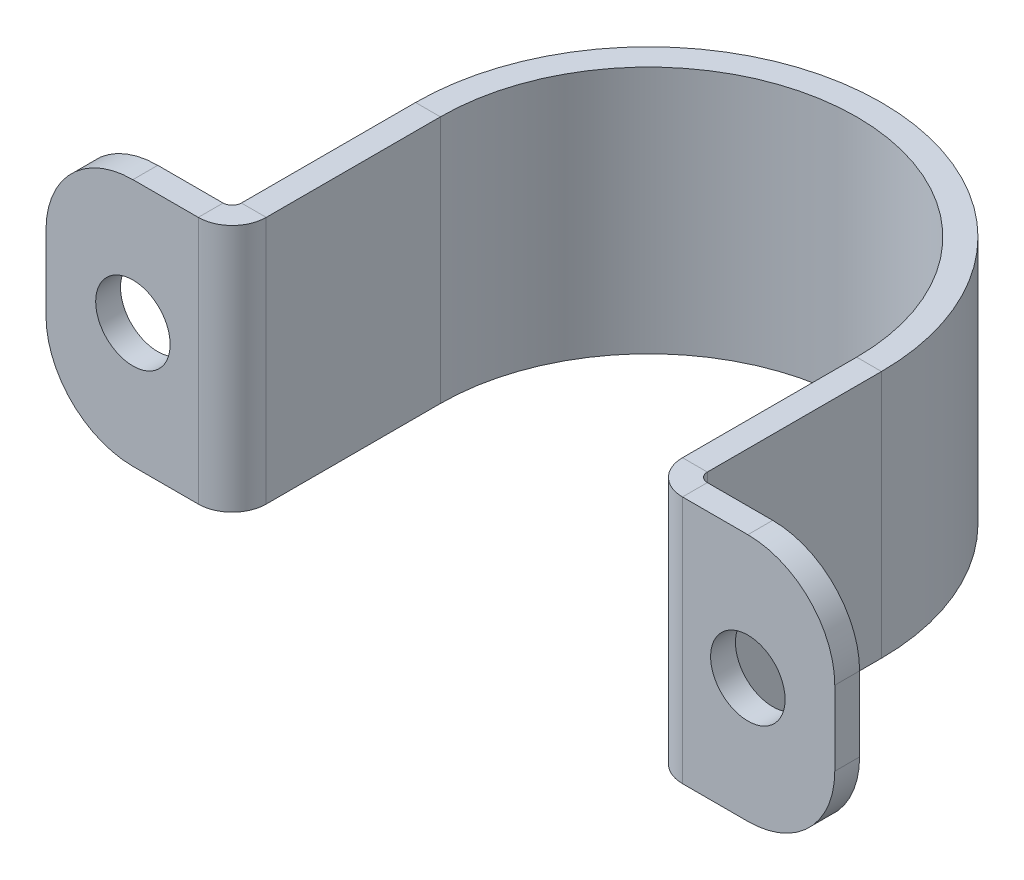
ISO-10303-21;
HEADER;
FILE_DESCRIPTION(('STEP AP214'),'2;1');
FILE_NAME('part.step','',(''),(''),'','','');
FILE_SCHEMA(('AUTOMOTIVE_DESIGN { 1 0 10303 214 1 1 1 1 }'));
ENDSEC;
DATA;
#1=APPLICATION_CONTEXT('core data for automotive mechanical design processes');
#2=APPLICATION_PROTOCOL_DEFINITION('international standard','automotive_design',2000,#1);
#3=PRODUCT_CONTEXT('',#1,'mechanical');
#4=PRODUCT('Part','Part','',(#3));
#5=PRODUCT_RELATED_PRODUCT_CATEGORY('part','',(#4));
#6=PRODUCT_DEFINITION_FORMATION('','',#4);
#7=PRODUCT_DEFINITION_CONTEXT('part definition',#1,'design');
#8=PRODUCT_DEFINITION('design','',#6,#7);
#9=PRODUCT_DEFINITION_SHAPE('','',#8);
#10=(LENGTH_UNIT() NAMED_UNIT(*) SI_UNIT(.MILLI.,.METRE.));
#11=(NAMED_UNIT(*) PLANE_ANGLE_UNIT() SI_UNIT($,.RADIAN.));
#12=(NAMED_UNIT(*) SI_UNIT($,.STERADIAN.) SOLID_ANGLE_UNIT());
#13=UNCERTAINTY_MEASURE_WITH_UNIT(LENGTH_MEASURE(1.E-05),#10,'distance_accuracy_value','');
#14=(GEOMETRIC_REPRESENTATION_CONTEXT(3) GLOBAL_UNCERTAINTY_ASSIGNED_CONTEXT((#13)) GLOBAL_UNIT_ASSIGNED_CONTEXT((#10,
#11,#12)) REPRESENTATION_CONTEXT('',''));
#15=CARTESIAN_POINT('',(0.,0.,0.));
#16=DIRECTION('',(0.,0.,1.));
#17=DIRECTION('',(1.,0.,0.));
#18=AXIS2_PLACEMENT_3D('',#15,#16,#17);
#19=CARTESIAN_POINT('',(-16.764,20.,-16.764));
#20=DIRECTION('',(0.,1.,0.));
#21=DIRECTION('',(0.,0.,1.));
#22=AXIS2_PLACEMENT_3D('',#19,#20,#21);
#23=PLANE('',#22);
#24=DIRECTION('',(-1.,0.,0.));
#25=VECTOR('',#24,1.);
#26=CARTESIAN_POINT('',(-16.764,20.,-16.764));
#27=LINE('',#26,#25);
#28=CARTESIAN_POINT('',(-16.764,20.,-16.764));
#29=VERTEX_POINT('',#28);
#30=CARTESIAN_POINT('',(-18.764,20.,-16.764));
#31=VERTEX_POINT('',#30);
#32=EDGE_CURVE('E345',#29,#31,#27,.T.);
#33=ORIENTED_EDGE('',*,*,#32,.F.);
#34=CARTESIAN_POINT('',(0.,20.,-16.764));
#35=DIRECTION('',(0.,-1.,0.));
#36=DIRECTION('',(0.,0.,-1.));
#37=AXIS2_PLACEMENT_3D('',#34,#35,#36);
#38=CIRCLE('',#37,16.764);
#39=CARTESIAN_POINT('',(16.764,20.,-16.764));
#40=VERTEX_POINT('',#39);
#41=EDGE_CURVE('E241',#29,#40,#38,.T.);
#42=ORIENTED_EDGE('',*,*,#41,.T.);
#43=DIRECTION('',(-1.,0.,0.));
#44=VECTOR('',#43,1.);
#45=CARTESIAN_POINT('',(18.764,20.,-16.764));
#46=LINE('',#45,#44);
#47=CARTESIAN_POINT('',(18.764,20.,-16.764));
#48=VERTEX_POINT('',#47);
#49=EDGE_CURVE('E343',#48,#40,#46,.T.);
#50=ORIENTED_EDGE('',*,*,#49,.F.);
#51=CARTESIAN_POINT('',(0.,20.,-16.764));
#52=DIRECTION('',(0.,1.,0.));
#53=DIRECTION('',(1.,0.,0.));
#54=AXIS2_PLACEMENT_3D('',#51,#52,#53);
#55=CIRCLE('',#54,18.764);
#56=EDGE_CURVE('E219',#31,#48,#55,.F.);
#57=ORIENTED_EDGE('',*,*,#56,.F.);
#58=EDGE_LOOP('',(#33,#42,#50,#57));
#59=FACE_BOUND('',#58,.T.);
#60=ADVANCED_FACE('F39',(#59),#23,.T.);
#61=CARTESIAN_POINT('',(18.764,20.,-16.764));
#62=DIRECTION('',(0.,1.,0.));
#63=DIRECTION('',(0.,0.,1.));
#64=AXIS2_PLACEMENT_3D('',#61,#62,#63);
#65=PLANE('',#64);
#66=DIRECTION('',(0.,0.,-1.));
#67=VECTOR('',#66,1.);
#68=CARTESIAN_POINT('',(-16.764,20.,0.));
#69=LINE('',#68,#67);
#70=CARTESIAN_POINT('',(-16.764,20.,-2.7366));
#71=VERTEX_POINT('',#70);
#72=EDGE_CURVE('E238',#71,#29,#69,.T.);
#73=ORIENTED_EDGE('',*,*,#72,.T.);
#74=ORIENTED_EDGE('',*,*,#32,.T.);
#75=DIRECTION('',(0.,0.,-1.));
#76=VECTOR('',#75,1.);
#77=CARTESIAN_POINT('',(-18.764,20.,0.));
#78=LINE('',#77,#76);
#79=CARTESIAN_POINT('',(-18.764,20.,-2.7366));
#80=VERTEX_POINT('',#79);
#81=EDGE_CURVE('E225',#80,#31,#78,.T.);
#82=ORIENTED_EDGE('',*,*,#81,.F.);
#83=DIRECTION('',(1.,0.,0.));
#84=VECTOR('',#83,1.);
#85=CARTESIAN_POINT('',(-18.764,20.,-2.7366));
#86=LINE('',#85,#84);
#87=EDGE_CURVE('E334',#80,#71,#86,.T.);
#88=ORIENTED_EDGE('',*,*,#87,.T.);
#89=EDGE_LOOP('',(#73,#74,#82,#88));
#90=FACE_BOUND('',#89,.T.);
#91=ADVANCED_FACE('F412',(#90),#65,.T.);
#92=CARTESIAN_POINT('',(16.764,0.,-16.764));
#93=DIRECTION('',(0.,-1.,0.));
#94=DIRECTION('',(0.,0.,-1.));
#95=AXIS2_PLACEMENT_3D('',#92,#93,#94);
#96=PLANE('',#95);
#97=DIRECTION('',(1.,0.,0.));
#98=VECTOR('',#97,1.);
#99=CARTESIAN_POINT('',(16.764,0.,-16.764));
#100=LINE('',#99,#98);
#101=CARTESIAN_POINT('',(16.764,0.,-16.764));
#102=VERTEX_POINT('',#101);
#103=CARTESIAN_POINT('',(18.764,0.,-16.764));
#104=VERTEX_POINT('',#103);
#105=EDGE_CURVE('E341',#102,#104,#100,.T.);
#106=ORIENTED_EDGE('',*,*,#105,.F.);
#107=CARTESIAN_POINT('',(0.,0.,-16.764));
#108=DIRECTION('',(0.,-1.,0.));
#109=DIRECTION('',(0.,0.,-1.));
#110=AXIS2_PLACEMENT_3D('',#107,#108,#109);
#111=CIRCLE('',#110,16.764);
#112=CARTESIAN_POINT('',(-16.764,0.,-16.764));
#113=VERTEX_POINT('',#112);
#114=EDGE_CURVE('E278',#113,#102,#111,.T.);
#115=ORIENTED_EDGE('',*,*,#114,.F.);
#116=DIRECTION('',(1.,0.,0.));
#117=VECTOR('',#116,1.);
#118=CARTESIAN_POINT('',(-18.764,0.,-16.764));
#119=LINE('',#118,#117);
#120=CARTESIAN_POINT('',(-18.764,0.,-16.764));
#121=VERTEX_POINT('',#120);
#122=EDGE_CURVE('E339',#121,#113,#119,.T.);
#123=ORIENTED_EDGE('',*,*,#122,.F.);
#124=CARTESIAN_POINT('',(0.,0.,-16.764));
#125=DIRECTION('',(0.,1.,0.));
#126=DIRECTION('',(1.,0.,0.));
#127=AXIS2_PLACEMENT_3D('',#124,#125,#126);
#128=CIRCLE('',#127,18.764);
#129=EDGE_CURVE('E259',#121,#104,#128,.F.);
#130=ORIENTED_EDGE('',*,*,#129,.T.);
#131=EDGE_LOOP('',(#106,#115,#123,#130));
#132=FACE_BOUND('',#131,.T.);
#133=ADVANCED_FACE('F477',(#132),#96,.T.);
#134=CARTESIAN_POINT('',(-18.764,0.,-16.764));
#135=DIRECTION('',(0.,-1.,0.));
#136=DIRECTION('',(0.,0.,-1.));
#137=AXIS2_PLACEMENT_3D('',#134,#135,#136);
#138=PLANE('',#137);
#139=DIRECTION('',(0.,0.,1.));
#140=VECTOR('',#139,1.);
#141=CARTESIAN_POINT('',(16.764,0.,0.));
#142=LINE('',#141,#140);
#143=CARTESIAN_POINT('',(16.764,0.,-2.7366));
#144=VERTEX_POINT('',#143);
#145=EDGE_CURVE('E281',#102,#144,#142,.T.);
#146=ORIENTED_EDGE('',*,*,#145,.F.);
#147=ORIENTED_EDGE('',*,*,#105,.T.);
#148=DIRECTION('',(0.,0.,-1.));
#149=VECTOR('',#148,1.);
#150=CARTESIAN_POINT('',(18.764,0.,0.));
#151=LINE('',#150,#149);
#152=CARTESIAN_POINT('',(18.764,0.,-2.7366));
#153=VERTEX_POINT('',#152);
#154=EDGE_CURVE('E256',#104,#153,#151,.F.);
#155=ORIENTED_EDGE('',*,*,#154,.T.);
#156=DIRECTION('',(-1.,0.,0.));
#157=VECTOR('',#156,1.);
#158=CARTESIAN_POINT('',(18.764,0.,-2.7366));
#159=LINE('',#158,#157);
#160=EDGE_CURVE('E325',#153,#144,#159,.T.);
#161=ORIENTED_EDGE('',*,*,#160,.T.);
#162=EDGE_LOOP('',(#146,#147,#155,#161));
#163=FACE_BOUND('',#162,.T.);
#164=ADVANCED_FACE('F739',(#163),#138,.T.);
#165=CARTESIAN_POINT('',(-19.5006,20.,0.));
#166=DIRECTION('',(0.,1.,0.));
#167=DIRECTION('',(0.,0.,1.));
#168=AXIS2_PLACEMENT_3D('',#165,#166,#167);
#169=PLANE('',#168);
#170=DIRECTION('',(0.,0.,-1.));
#171=VECTOR('',#170,1.);
#172=CARTESIAN_POINT('',(-19.5006,20.,0.));
#173=LINE('',#172,#171);
#174=CARTESIAN_POINT('',(-19.5006,20.,0.));
#175=VERTEX_POINT('',#174);
#176=CARTESIAN_POINT('',(-19.5006,20.,-2.));
#177=VERTEX_POINT('',#176);
#178=EDGE_CURVE('E336',#175,#177,#173,.T.);
#179=ORIENTED_EDGE('',*,*,#178,.F.);
#180=CARTESIAN_POINT('',(-19.5006,20.,-2.7366));
#181=DIRECTION('',(0.,-1.,0.));
#182=DIRECTION('',(0.,0.,-1.));
#183=AXIS2_PLACEMENT_3D('',#180,#181,#182);
#184=CIRCLE('',#183,2.7366);
#185=EDGE_CURVE('E235',#175,#71,#184,.F.);
#186=ORIENTED_EDGE('',*,*,#185,.T.);
#187=ORIENTED_EDGE('',*,*,#87,.F.);
#188=CARTESIAN_POINT('',(-19.5006,20.,-2.7366));
#189=DIRECTION('',(0.,1.,0.));
#190=DIRECTION('',(1.,0.,0.));
#191=AXIS2_PLACEMENT_3D('',#188,#189,#190);
#192=CIRCLE('',#191,0.7366);
#193=EDGE_CURVE('E228',#177,#80,#192,.T.);
#194=ORIENTED_EDGE('',*,*,#193,.F.);
#195=EDGE_LOOP('',(#179,#186,#187,#194));
#196=FACE_BOUND('',#195,.T.);
#197=ADVANCED_FACE('F403',(#196),#169,.T.);
#198=CARTESIAN_POINT('',(-18.764,20.,-2.7366));
#199=DIRECTION('',(0.,1.,0.));
#200=DIRECTION('',(0.,0.,1.));
#201=AXIS2_PLACEMENT_3D('',#198,#199,#200);
#202=PLANE('',#201);
#203=DIRECTION('',(1.,0.,0.));
#204=VECTOR('',#203,1.);
#205=CARTESIAN_POINT('',(-31.764,20.,-2.));
#206=LINE('',#205,#204);
#207=CARTESIAN_POINT('',(-24.764,20.,-2.));
#208=VERTEX_POINT('',#207);
#209=EDGE_CURVE('E231',#208,#177,#206,.T.);
#210=ORIENTED_EDGE('',*,*,#209,.F.);
#211=DIRECTION('',(0.,0.,-1.));
#212=VECTOR('',#211,1.);
#213=CARTESIAN_POINT('',(-24.764,20.,-2.7366));
#214=LINE('',#213,#212);
#215=CARTESIAN_POINT('',(-24.764,20.,0.));
#216=VERTEX_POINT('',#215);
#217=EDGE_CURVE('E11',#208,#216,#214,.F.);
#218=ORIENTED_EDGE('',*,*,#217,.T.);
#219=DIRECTION('',(1.,0.,0.));
#220=VECTOR('',#219,1.);
#221=CARTESIAN_POINT('',(-31.764,20.,0.));
#222=LINE('',#221,#220);
#223=EDGE_CURVE('E233',#216,#175,#222,.T.);
#224=ORIENTED_EDGE('',*,*,#223,.T.);
#225=ORIENTED_EDGE('',*,*,#178,.T.);
#226=EDGE_LOOP('',(#210,#218,#224,#225));
#227=FACE_BOUND('',#226,.T.);
#228=ADVANCED_FACE('F395',(#227),#202,.T.);
#229=CARTESIAN_POINT('',(-16.764,0.,-2.7366));
#230=DIRECTION('',(0.,-1.,0.));
#231=DIRECTION('',(0.,0.,-1.));
#232=AXIS2_PLACEMENT_3D('',#229,#230,#231);
#233=PLANE('',#232);
#234=DIRECTION('',(-1.,0.,0.));
#235=VECTOR('',#234,1.);
#236=CARTESIAN_POINT('',(-16.764,0.,-2.7366));
#237=LINE('',#236,#235);
#238=CARTESIAN_POINT('',(-16.764,0.,-2.7366));
#239=VERTEX_POINT('',#238);
#240=CARTESIAN_POINT('',(-18.764,0.,-2.7366));
#241=VERTEX_POINT('',#240);
#242=EDGE_CURVE('E332',#239,#241,#237,.T.);
#243=ORIENTED_EDGE('',*,*,#242,.F.);
#244=CARTESIAN_POINT('',(-19.5006,0.,-2.7366));
#245=DIRECTION('',(0.,-1.,0.));
#246=DIRECTION('',(0.,0.,-1.));
#247=AXIS2_PLACEMENT_3D('',#244,#245,#246);
#248=CIRCLE('',#247,2.7366);
#249=CARTESIAN_POINT('',(-19.5006,0.,0.));
#250=VERTEX_POINT('',#249);
#251=EDGE_CURVE('E272',#250,#239,#248,.F.);
#252=ORIENTED_EDGE('',*,*,#251,.F.);
#253=DIRECTION('',(0.,0.,1.));
#254=VECTOR('',#253,1.);
#255=CARTESIAN_POINT('',(-19.5006,0.,-2.));
#256=LINE('',#255,#254);
#257=CARTESIAN_POINT('',(-19.5006,0.,-2.));
#258=VERTEX_POINT('',#257);
#259=EDGE_CURVE('E329',#258,#250,#256,.T.);
#260=ORIENTED_EDGE('',*,*,#259,.F.);
#261=CARTESIAN_POINT('',(-19.5006,0.,-2.7366));
#262=DIRECTION('',(0.,1.,0.));
#263=DIRECTION('',(1.,0.,0.));
#264=AXIS2_PLACEMENT_3D('',#261,#262,#263);
#265=CIRCLE('',#264,0.7366);
#266=EDGE_CURVE('E265',#258,#241,#265,.T.);
#267=ORIENTED_EDGE('',*,*,#266,.T.);
#268=EDGE_LOOP('',(#243,#252,#260,#267));
#269=FACE_BOUND('',#268,.T.);
#270=ADVANCED_FACE('F746',(#269),#233,.T.);
#271=CARTESIAN_POINT('',(-19.5006,0.,-2.));
#272=DIRECTION('',(0.,-1.,0.));
#273=DIRECTION('',(0.,0.,-1.));
#274=AXIS2_PLACEMENT_3D('',#271,#272,#273);
#275=PLANE('',#274);
#276=DIRECTION('',(0.,0.,-1.));
#277=VECTOR('',#276,1.);
#278=CARTESIAN_POINT('',(-16.764,0.,0.));
#279=LINE('',#278,#277);
#280=EDGE_CURVE('E275',#239,#113,#279,.T.);
#281=ORIENTED_EDGE('',*,*,#280,.F.);
#282=ORIENTED_EDGE('',*,*,#242,.T.);
#283=DIRECTION('',(0.,0.,-1.));
#284=VECTOR('',#283,1.);
#285=CARTESIAN_POINT('',(-18.764,0.,0.));
#286=LINE('',#285,#284);
#287=EDGE_CURVE('E262',#241,#121,#286,.T.);
#288=ORIENTED_EDGE('',*,*,#287,.T.);
#289=ORIENTED_EDGE('',*,*,#122,.T.);
#290=EDGE_LOOP('',(#281,#282,#288,#289));
#291=FACE_BOUND('',#290,.T.);
#292=ADVANCED_FACE('F750',(#291),#275,.T.);
#293=CARTESIAN_POINT('',(16.764,20.,-2.7366));
#294=DIRECTION('',(0.,1.,0.));
#295=DIRECTION('',(0.,0.,1.));
#296=AXIS2_PLACEMENT_3D('',#293,#294,#295);
#297=PLANE('',#296);
#298=DIRECTION('',(1.,0.,0.));
#299=VECTOR('',#298,1.);
#300=CARTESIAN_POINT('',(16.764,20.,-2.7366));
#301=LINE('',#300,#299);
#302=CARTESIAN_POINT('',(16.764,20.,-2.7366));
#303=VERTEX_POINT('',#302);
#304=CARTESIAN_POINT('',(18.764,20.,-2.7366));
#305=VERTEX_POINT('',#304);
#306=EDGE_CURVE('E189',#303,#305,#301,.T.);
#307=ORIENTED_EDGE('',*,*,#306,.F.);
#308=CARTESIAN_POINT('',(19.5006,20.,-2.7366));
#309=DIRECTION('',(0.,-1.,0.));
#310=DIRECTION('',(0.,0.,-1.));
#311=AXIS2_PLACEMENT_3D('',#308,#309,#310);
#312=CIRCLE('',#311,2.7366);
#313=CARTESIAN_POINT('',(19.5006,20.,0.));
#314=VERTEX_POINT('',#313);
#315=EDGE_CURVE('E184',#303,#314,#312,.F.);
#316=ORIENTED_EDGE('',*,*,#315,.T.);
#317=DIRECTION('',(0.,0.,1.));
#318=VECTOR('',#317,1.);
#319=CARTESIAN_POINT('',(19.5006,20.,-2.));
#320=LINE('',#319,#318);
#321=CARTESIAN_POINT('',(19.5006,20.,-2.));
#322=VERTEX_POINT('',#321);
#323=EDGE_CURVE('E177',#322,#314,#320,.T.);
#324=ORIENTED_EDGE('',*,*,#323,.F.);
#325=CARTESIAN_POINT('',(19.5006,20.,-2.7366));
#326=DIRECTION('',(0.,1.,0.));
#327=DIRECTION('',(1.,0.,0.));
#328=AXIS2_PLACEMENT_3D('',#325,#326,#327);
#329=CIRCLE('',#328,0.7366);
#330=EDGE_CURVE('E181',#305,#322,#329,.T.);
#331=ORIENTED_EDGE('',*,*,#330,.F.);
#332=EDGE_LOOP('',(#307,#316,#324,#331));
#333=FACE_BOUND('',#332,.T.);
#334=ADVANCED_FACE('F179',(#333),#297,.T.);
#335=CARTESIAN_POINT('',(19.5006,20.,-2.));
#336=DIRECTION('',(0.,1.,0.));
#337=DIRECTION('',(0.,0.,1.));
#338=AXIS2_PLACEMENT_3D('',#335,#336,#337);
#339=PLANE('',#338);
#340=DIRECTION('',(0.,0.,1.));
#341=VECTOR('',#340,1.);
#342=CARTESIAN_POINT('',(16.764,20.,0.));
#343=LINE('',#342,#341);
#344=EDGE_CURVE('E244',#40,#303,#343,.T.);
#345=ORIENTED_EDGE('',*,*,#344,.T.);
#346=ORIENTED_EDGE('',*,*,#306,.T.);
#347=DIRECTION('',(0.,0.,-1.));
#348=VECTOR('',#347,1.);
#349=CARTESIAN_POINT('',(18.764,20.,0.));
#350=LINE('',#349,#348);
#351=EDGE_CURVE('E217',#48,#305,#350,.F.);
#352=ORIENTED_EDGE('',*,*,#351,.F.);
#353=ORIENTED_EDGE('',*,*,#49,.T.);
#354=EDGE_LOOP('',(#345,#346,#352,#353));
#355=FACE_BOUND('',#354,.T.);
#356=ADVANCED_FACE('F429',(#355),#339,.T.);
#357=CARTESIAN_POINT('',(19.5006,0.,0.));
#358=DIRECTION('',(0.,-1.,0.));
#359=DIRECTION('',(0.,0.,-1.));
#360=AXIS2_PLACEMENT_3D('',#357,#358,#359);
#361=PLANE('',#360);
#362=DIRECTION('',(0.,0.,-1.));
#363=VECTOR('',#362,1.);
#364=CARTESIAN_POINT('',(19.5006,0.,0.));
#365=LINE('',#364,#363);
#366=CARTESIAN_POINT('',(19.5006,0.,0.));
#367=VERTEX_POINT('',#366);
#368=CARTESIAN_POINT('',(19.5006,0.,-2.));
#369=VERTEX_POINT('',#368);
#370=EDGE_CURVE('E190',#367,#369,#365,.T.);
#371=ORIENTED_EDGE('',*,*,#370,.F.);
#372=CARTESIAN_POINT('',(19.5006,0.,-2.7366));
#373=DIRECTION('',(0.,-1.,0.));
#374=DIRECTION('',(0.,0.,-1.));
#375=AXIS2_PLACEMENT_3D('',#372,#373,#374);
#376=CIRCLE('',#375,2.7366);
#377=EDGE_CURVE('E284',#144,#367,#376,.F.);
#378=ORIENTED_EDGE('',*,*,#377,.F.);
#379=ORIENTED_EDGE('',*,*,#160,.F.);
#380=CARTESIAN_POINT('',(19.5006,0.,-2.7366));
#381=DIRECTION('',(0.,1.,0.));
#382=DIRECTION('',(1.,0.,0.));
#383=AXIS2_PLACEMENT_3D('',#380,#381,#382);
#384=CIRCLE('',#383,0.7366);
#385=EDGE_CURVE('E254',#153,#369,#384,.T.);
#386=ORIENTED_EDGE('',*,*,#385,.T.);
#387=EDGE_LOOP('',(#371,#378,#379,#386));
#388=FACE_BOUND('',#387,.T.);
#389=ADVANCED_FACE('F469',(#388),#361,.T.);
#390=CARTESIAN_POINT('',(18.764,0.,-2.7366));
#391=DIRECTION('',(0.,-1.,0.));
#392=DIRECTION('',(0.,0.,-1.));
#393=AXIS2_PLACEMENT_3D('',#390,#391,#392);
#394=PLANE('',#393);
#395=DIRECTION('',(1.,0.,0.));
#396=VECTOR('',#395,1.);
#397=CARTESIAN_POINT('',(16.764,0.,-2.));
#398=LINE('',#397,#396);
#399=CARTESIAN_POINT('',(24.764,0.,-2.));
#400=VERTEX_POINT('',#399);
#401=EDGE_CURVE('E202',#369,#400,#398,.T.);
#402=ORIENTED_EDGE('',*,*,#401,.T.);
#403=DIRECTION('',(0.,0.,1.));
#404=VECTOR('',#403,1.);
#405=CARTESIAN_POINT('',(24.764,0.,-2.7366));
#406=LINE('',#405,#404);
#407=CARTESIAN_POINT('',(24.764,0.,0.));
#408=VERTEX_POINT('',#407);
#409=EDGE_CURVE('E347',#400,#408,#406,.T.);
#410=ORIENTED_EDGE('',*,*,#409,.T.);
#411=DIRECTION('',(1.,0.,0.));
#412=VECTOR('',#411,1.);
#413=CARTESIAN_POINT('',(16.764,0.,0.));
#414=LINE('',#413,#412);
#415=EDGE_CURVE('E249',#367,#408,#414,.T.);
#416=ORIENTED_EDGE('',*,*,#415,.F.);
#417=ORIENTED_EDGE('',*,*,#370,.T.);
#418=EDGE_LOOP('',(#402,#410,#416,#417));
#419=FACE_BOUND('',#418,.T.);
#420=ADVANCED_FACE('F461',(#419),#394,.T.);
#421=CARTESIAN_POINT('',(16.764,20.,0.));
#422=DIRECTION('',(0.,0.,-1.));
#423=DIRECTION('',(-1.,0.,0.));
#424=AXIS2_PLACEMENT_3D('',#421,#422,#423);
#425=PLANE('',#424);
#426=CARTESIAN_POINT('',(24.764,10.,0.));
#427=DIRECTION('',(0.,0.,1.));
#428=DIRECTION('',(1.,0.,0.));
#429=AXIS2_PLACEMENT_3D('',#426,#427,#428);
#430=CIRCLE('',#429,3.);
#431=CARTESIAN_POINT('',(27.764,10.,0.));
#432=VERTEX_POINT('',#431);
#433=EDGE_CURVE('E447',#432,#432,#430,.T.);
#434=ORIENTED_EDGE('',*,*,#433,.F.);
#435=EDGE_LOOP('',(#434));
#436=FACE_BOUND('',#435,.T.);
#437=ORIENTED_EDGE('',*,*,#415,.T.);
#438=CARTESIAN_POINT('',(24.764,7.,0.));
#439=DIRECTION('',(0.,0.,-1.));
#440=DIRECTION('',(-1.,0.,0.));
#441=AXIS2_PLACEMENT_3D('',#438,#439,#440);
#442=CIRCLE('',#441,7.);
#443=CARTESIAN_POINT('',(31.764,7.,0.));
#444=VERTEX_POINT('',#443);
#445=EDGE_CURVE('E352',#408,#444,#442,.F.);
#446=ORIENTED_EDGE('',*,*,#445,.T.);
#447=DIRECTION('',(0.,-1.,0.));
#448=VECTOR('',#447,1.);
#449=CARTESIAN_POINT('',(31.764,20.,0.));
#450=LINE('',#449,#448);
#451=CARTESIAN_POINT('',(31.764,13.,0.));
#452=VERTEX_POINT('',#451);
#453=EDGE_CURVE('E322',#452,#444,#450,.T.);
#454=ORIENTED_EDGE('',*,*,#453,.F.);
#455=CARTESIAN_POINT('',(24.764,13.,0.));
#456=DIRECTION('',(0.,0.,-1.));
#457=DIRECTION('',(-1.,0.,0.));
#458=AXIS2_PLACEMENT_3D('',#455,#456,#457);
#459=CIRCLE('',#458,7.);
#460=CARTESIAN_POINT('',(24.764,20.,0.));
#461=VERTEX_POINT('',#460);
#462=EDGE_CURVE('E350',#452,#461,#459,.F.);
#463=ORIENTED_EDGE('',*,*,#462,.T.);
#464=DIRECTION('',(1.,0.,0.));
#465=VECTOR('',#464,1.);
#466=CARTESIAN_POINT('',(16.764,20.,0.));
#467=LINE('',#466,#465);
#468=EDGE_CURVE('E212',#314,#461,#467,.T.);
#469=ORIENTED_EDGE('',*,*,#468,.F.);
#470=DIRECTION('',(0.,-1.,0.));
#471=VECTOR('',#470,1.);
#472=CARTESIAN_POINT('',(19.5006,20.,0.));
#473=LINE('',#472,#471);
#474=EDGE_CURVE('E248',#314,#367,#473,.T.);
#475=ORIENTED_EDGE('',*,*,#474,.T.);
#476=EDGE_LOOP('',(#437,#446,#454,#463,#469,#475));
#477=FACE_BOUND('',#476,.T.);
#478=ADVANCED_FACE('F441',(#436,#477),#425,.F.);
#479=CARTESIAN_POINT('',(31.764,20.,-2.));
#480=DIRECTION('',(1.,0.,0.));
#481=DIRECTION('',(0.,0.,-1.));
#482=AXIS2_PLACEMENT_3D('',#479,#480,#481);
#483=PLANE('',#482);
#484=ORIENTED_EDGE('',*,*,#453,.T.);
#485=DIRECTION('',(0.,0.,1.));
#486=VECTOR('',#485,1.);
#487=CARTESIAN_POINT('',(31.764,7.,-2.));
#488=LINE('',#487,#486);
#489=CARTESIAN_POINT('',(31.764,7.,-2.));
#490=VERTEX_POINT('',#489);
#491=EDGE_CURVE('E357',#444,#490,#488,.F.);
#492=ORIENTED_EDGE('',*,*,#491,.T.);
#493=DIRECTION('',(0.,-1.,0.));
#494=VECTOR('',#493,1.);
#495=CARTESIAN_POINT('',(31.764,20.,-2.));
#496=LINE('',#495,#494);
#497=CARTESIAN_POINT('',(31.764,13.,-2.));
#498=VERTEX_POINT('',#497);
#499=EDGE_CURVE('E206',#498,#490,#496,.T.);
#500=ORIENTED_EDGE('',*,*,#499,.F.);
#501=DIRECTION('',(0.,0.,1.));
#502=VECTOR('',#501,1.);
#503=CARTESIAN_POINT('',(31.764,13.,-2.));
#504=LINE('',#503,#502);
#505=EDGE_CURVE('E354',#498,#452,#504,.T.);
#506=ORIENTED_EDGE('',*,*,#505,.T.);
#507=EDGE_LOOP('',(#484,#492,#500,#506));
#508=FACE_BOUND('',#507,.T.);
#509=ADVANCED_FACE('F460',(#508),#483,.T.);
#510=CARTESIAN_POINT('',(16.764,20.,-2.));
#511=DIRECTION('',(0.,0.,-1.));
#512=DIRECTION('',(-1.,0.,0.));
#513=AXIS2_PLACEMENT_3D('',#510,#511,#512);
#514=PLANE('',#513);
#515=CARTESIAN_POINT('',(24.764,10.,-2.));
#516=DIRECTION('',(0.,0.,1.));
#517=DIRECTION('',(1.,0.,0.));
#518=AXIS2_PLACEMENT_3D('',#515,#516,#517);
#519=CIRCLE('',#518,3.);
#520=CARTESIAN_POINT('',(27.764,10.,-2.));
#521=VERTEX_POINT('',#520);
#522=EDGE_CURVE('E450',#521,#521,#519,.T.);
#523=ORIENTED_EDGE('',*,*,#522,.T.);
#524=EDGE_LOOP('',(#523));
#525=FACE_BOUND('',#524,.T.);
#526=ORIENTED_EDGE('',*,*,#499,.T.);
#527=CARTESIAN_POINT('',(24.764,7.,-2.));
#528=DIRECTION('',(0.,0.,-1.));
#529=DIRECTION('',(-1.,0.,0.));
#530=AXIS2_PLACEMENT_3D('',#527,#528,#529);
#531=CIRCLE('',#530,7.);
#532=EDGE_CURVE('E361',#490,#400,#531,.T.);
#533=ORIENTED_EDGE('',*,*,#532,.T.);
#534=ORIENTED_EDGE('',*,*,#401,.F.);
#535=DIRECTION('',(0.,-1.,0.));
#536=VECTOR('',#535,1.);
#537=CARTESIAN_POINT('',(19.5006,20.,-2.));
#538=LINE('',#537,#536);
#539=EDGE_CURVE('E196',#322,#369,#538,.T.);
#540=ORIENTED_EDGE('',*,*,#539,.F.);
#541=DIRECTION('',(1.,0.,0.));
#542=VECTOR('',#541,1.);
#543=CARTESIAN_POINT('',(16.764,20.,-2.));
#544=LINE('',#543,#542);
#545=CARTESIAN_POINT('',(24.764,20.,-2.));
#546=VERTEX_POINT('',#545);
#547=EDGE_CURVE('E199',#322,#546,#544,.T.);
#548=ORIENTED_EDGE('',*,*,#547,.T.);
#549=CARTESIAN_POINT('',(24.764,13.,-2.));
#550=DIRECTION('',(0.,0.,-1.));
#551=DIRECTION('',(-1.,0.,0.));
#552=AXIS2_PLACEMENT_3D('',#549,#550,#551);
#553=CIRCLE('',#552,7.);
#554=EDGE_CURVE('E359',#546,#498,#553,.T.);
#555=ORIENTED_EDGE('',*,*,#554,.T.);
#556=EDGE_LOOP('',(#526,#533,#534,#540,#548,#555));
#557=FACE_BOUND('',#556,.T.);
#558=ADVANCED_FACE('F198',(#525,#557),#514,.T.);
#559=CARTESIAN_POINT('',(19.5006,20.,-2.7366));
#560=DIRECTION('',(0.,-1.,0.));
#561=DIRECTION('',(0.,0.,-1.));
#562=AXIS2_PLACEMENT_3D('',#559,#560,#561);
#563=CYLINDRICAL_SURFACE('',#562,0.7366);
#564=ORIENTED_EDGE('',*,*,#385,.F.);
#565=DIRECTION('',(0.,-1.,0.));
#566=VECTOR('',#565,1.);
#567=CARTESIAN_POINT('',(18.764,20.,-2.7366));
#568=LINE('',#567,#566);
#569=EDGE_CURVE('E207',#305,#153,#568,.T.);
#570=ORIENTED_EDGE('',*,*,#569,.F.);
#571=ORIENTED_EDGE('',*,*,#330,.T.);
#572=ORIENTED_EDGE('',*,*,#539,.T.);
#573=EDGE_LOOP('',(#564,#570,#571,#572));
#574=FACE_BOUND('',#573,.T.);
#575=ADVANCED_FACE('F215',(#574),#563,.F.);
#576=CARTESIAN_POINT('',(18.764,20.,0.));
#577=DIRECTION('',(1.,0.,0.));
#578=DIRECTION('',(0.,0.,-1.));
#579=AXIS2_PLACEMENT_3D('',#576,#577,#578);
#580=PLANE('',#579);
#581=ORIENTED_EDGE('',*,*,#154,.F.);
#582=DIRECTION('',(0.,-1.,0.));
#583=VECTOR('',#582,1.);
#584=CARTESIAN_POINT('',(18.764,20.,-16.764));
#585=LINE('',#584,#583);
#586=EDGE_CURVE('E317',#48,#104,#585,.T.);
#587=ORIENTED_EDGE('',*,*,#586,.F.);
#588=ORIENTED_EDGE('',*,*,#351,.T.);
#589=ORIENTED_EDGE('',*,*,#569,.T.);
#590=EDGE_LOOP('',(#581,#587,#588,#589));
#591=FACE_BOUND('',#590,.T.);
#592=ADVANCED_FACE('F428',(#591),#580,.T.);
#593=CARTESIAN_POINT('',(0.,20.,-16.764));
#594=DIRECTION('',(0.,-1.,0.));
#595=DIRECTION('',(0.,0.,-1.));
#596=AXIS2_PLACEMENT_3D('',#593,#594,#595);
#597=CYLINDRICAL_SURFACE('',#596,18.764);
#598=ORIENTED_EDGE('',*,*,#129,.F.);
#599=DIRECTION('',(0.,-1.,0.));
#600=VECTOR('',#599,1.);
#601=CARTESIAN_POINT('',(-18.764,20.,-16.764));
#602=LINE('',#601,#600);
#603=EDGE_CURVE('E314',#31,#121,#602,.T.);
#604=ORIENTED_EDGE('',*,*,#603,.F.);
#605=ORIENTED_EDGE('',*,*,#56,.T.);
#606=ORIENTED_EDGE('',*,*,#586,.T.);
#607=EDGE_LOOP('',(#598,#604,#605,#606));
#608=FACE_BOUND('',#607,.T.);
#609=ADVANCED_FACE('F420',(#608),#597,.T.);
#610=CARTESIAN_POINT('',(-18.764,20.,0.));
#611=DIRECTION('',(-1.,0.,0.));
#612=DIRECTION('',(0.,0.,1.));
#613=AXIS2_PLACEMENT_3D('',#610,#611,#612);
#614=PLANE('',#613);
#615=ORIENTED_EDGE('',*,*,#287,.F.);
#616=DIRECTION('',(0.,-1.,0.));
#617=VECTOR('',#616,1.);
#618=CARTESIAN_POINT('',(-18.764,20.,-2.7366));
#619=LINE('',#618,#617);
#620=EDGE_CURVE('E311',#80,#241,#619,.T.);
#621=ORIENTED_EDGE('',*,*,#620,.F.);
#622=ORIENTED_EDGE('',*,*,#81,.T.);
#623=ORIENTED_EDGE('',*,*,#603,.T.);
#624=EDGE_LOOP('',(#615,#621,#622,#623));
#625=FACE_BOUND('',#624,.T.);
#626=ADVANCED_FACE('F411',(#625),#614,.T.);
#627=CARTESIAN_POINT('',(-19.5006,20.,-2.7366));
#628=DIRECTION('',(0.,-1.,0.));
#629=DIRECTION('',(0.,0.,-1.));
#630=AXIS2_PLACEMENT_3D('',#627,#628,#629);
#631=CYLINDRICAL_SURFACE('',#630,0.7366);
#632=ORIENTED_EDGE('',*,*,#266,.F.);
#633=DIRECTION('',(0.,-1.,0.));
#634=VECTOR('',#633,1.);
#635=CARTESIAN_POINT('',(-19.5006,20.,-2.));
#636=LINE('',#635,#634);
#637=EDGE_CURVE('E308',#177,#258,#636,.T.);
#638=ORIENTED_EDGE('',*,*,#637,.F.);
#639=ORIENTED_EDGE('',*,*,#193,.T.);
#640=ORIENTED_EDGE('',*,*,#620,.T.);
#641=EDGE_LOOP('',(#632,#638,#639,#640));
#642=FACE_BOUND('',#641,.T.);
#643=ADVANCED_FACE('F402',(#642),#631,.F.);
#644=CARTESIAN_POINT('',(-31.764,20.,-2.));
#645=DIRECTION('',(0.,0.,-1.));
#646=DIRECTION('',(-1.,0.,0.));
#647=AXIS2_PLACEMENT_3D('',#644,#645,#646);
#648=PLANE('',#647);
#649=CARTESIAN_POINT('',(-24.764,10.,-2.));
#650=DIRECTION('',(0.,0.,-1.));
#651=DIRECTION('',(-1.,0.,0.));
#652=AXIS2_PLACEMENT_3D('',#649,#650,#651);
#653=CIRCLE('',#652,3.);
#654=CARTESIAN_POINT('',(-27.764,10.,-2.));
#655=VERTEX_POINT('',#654);
#656=EDGE_CURVE('E444',#655,#655,#653,.T.);
#657=ORIENTED_EDGE('',*,*,#656,.F.);
#658=EDGE_LOOP('',(#657));
#659=FACE_BOUND('',#658,.T.);
#660=DIRECTION('',(1.,0.,0.));
#661=VECTOR('',#660,1.);
#662=CARTESIAN_POINT('',(-31.764,0.,-2.));
#663=LINE('',#662,#661);
#664=CARTESIAN_POINT('',(-24.764,0.,-2.));
#665=VERTEX_POINT('',#664);
#666=EDGE_CURVE('E268',#665,#258,#663,.T.);
#667=ORIENTED_EDGE('',*,*,#666,.F.);
#668=CARTESIAN_POINT('',(-24.764,7.,-2.));
#669=DIRECTION('',(0.,0.,-1.));
#670=DIRECTION('',(-1.,0.,0.));
#671=AXIS2_PLACEMENT_3D('',#668,#669,#670);
#672=CIRCLE('',#671,7.);
#673=CARTESIAN_POINT('',(-31.764,7.,-2.));
#674=VERTEX_POINT('',#673);
#675=EDGE_CURVE('E369',#665,#674,#672,.T.);
#676=ORIENTED_EDGE('',*,*,#675,.T.);
#677=DIRECTION('',(0.,-1.,0.));
#678=VECTOR('',#677,1.);
#679=CARTESIAN_POINT('',(-31.764,20.,-2.));
#680=LINE('',#679,#678);
#681=CARTESIAN_POINT('',(-31.764,13.,-2.));
#682=VERTEX_POINT('',#681);
#683=EDGE_CURVE('E306',#682,#674,#680,.T.);
#684=ORIENTED_EDGE('',*,*,#683,.F.);
#685=CARTESIAN_POINT('',(-24.764,13.,-2.));
#686=DIRECTION('',(0.,0.,-1.));
#687=DIRECTION('',(-1.,0.,0.));
#688=AXIS2_PLACEMENT_3D('',#685,#686,#687);
#689=CIRCLE('',#688,7.);
#690=EDGE_CURVE('E367',#682,#208,#689,.T.);
#691=ORIENTED_EDGE('',*,*,#690,.T.);
#692=ORIENTED_EDGE('',*,*,#209,.T.);
#693=ORIENTED_EDGE('',*,*,#637,.T.);
#694=EDGE_LOOP('',(#667,#676,#684,#691,#692,#693));
#695=FACE_BOUND('',#694,.T.);
#696=ADVANCED_FACE('F390',(#659,#695),#648,.T.);
#697=CARTESIAN_POINT('',(-31.764,20.,0.));
#698=DIRECTION('',(-1.,0.,0.));
#699=DIRECTION('',(0.,0.,1.));
#700=AXIS2_PLACEMENT_3D('',#697,#698,#699);
#701=PLANE('',#700);
#702=ORIENTED_EDGE('',*,*,#683,.T.);
#703=DIRECTION('',(0.,0.,-1.));
#704=VECTOR('',#703,1.);
#705=CARTESIAN_POINT('',(-31.764,7.,0.));
#706=LINE('',#705,#704);
#707=CARTESIAN_POINT('',(-31.764,7.,0.));
#708=VERTEX_POINT('',#707);
#709=EDGE_CURVE('E60',#674,#708,#706,.F.);
#710=ORIENTED_EDGE('',*,*,#709,.T.);
#711=DIRECTION('',(0.,-1.,0.));
#712=VECTOR('',#711,1.);
#713=CARTESIAN_POINT('',(-31.764,20.,0.));
#714=LINE('',#713,#712);
#715=CARTESIAN_POINT('',(-31.764,13.,0.));
#716=VERTEX_POINT('',#715);
#717=EDGE_CURVE('E304',#716,#708,#714,.T.);
#718=ORIENTED_EDGE('',*,*,#717,.F.);
#719=DIRECTION('',(0.,0.,-1.));
#720=VECTOR('',#719,1.);
#721=CARTESIAN_POINT('',(-31.764,13.,0.));
#722=LINE('',#721,#720);
#723=EDGE_CURVE('E371',#716,#682,#722,.T.);
#724=ORIENTED_EDGE('',*,*,#723,.T.);
#725=EDGE_LOOP('',(#702,#710,#718,#724));
#726=FACE_BOUND('',#725,.T.);
#727=ADVANCED_FACE('F391',(#726),#701,.T.);
#728=CARTESIAN_POINT('',(-31.764,20.,0.));
#729=DIRECTION('',(0.,0.,-1.));
#730=DIRECTION('',(-1.,0.,0.));
#731=AXIS2_PLACEMENT_3D('',#728,#729,#730);
#732=PLANE('',#731);
#733=CARTESIAN_POINT('',(-24.764,10.,0.));
#734=DIRECTION('',(0.,0.,-1.));
#735=DIRECTION('',(-1.,0.,0.));
#736=AXIS2_PLACEMENT_3D('',#733,#734,#735);
#737=CIRCLE('',#736,3.);
#738=CARTESIAN_POINT('',(-27.764,10.,0.));
#739=VERTEX_POINT('',#738);
#740=EDGE_CURVE('E252',#739,#739,#737,.T.);
#741=ORIENTED_EDGE('',*,*,#740,.T.);
#742=EDGE_LOOP('',(#741));
#743=FACE_BOUND('',#742,.T.);
#744=ORIENTED_EDGE('',*,*,#717,.T.);
#745=CARTESIAN_POINT('',(-24.764,7.,0.));
#746=DIRECTION('',(0.,0.,-1.));
#747=DIRECTION('',(-1.,0.,0.));
#748=AXIS2_PLACEMENT_3D('',#745,#746,#747);
#749=CIRCLE('',#748,7.);
#750=CARTESIAN_POINT('',(-24.764,0.,0.));
#751=VERTEX_POINT('',#750);
#752=EDGE_CURVE('E47',#708,#751,#749,.F.);
#753=ORIENTED_EDGE('',*,*,#752,.T.);
#754=DIRECTION('',(1.,0.,0.));
#755=VECTOR('',#754,1.);
#756=CARTESIAN_POINT('',(-31.764,0.,0.));
#757=LINE('',#756,#755);
#758=EDGE_CURVE('E270',#751,#250,#757,.T.);
#759=ORIENTED_EDGE('',*,*,#758,.T.);
#760=DIRECTION('',(0.,-1.,0.));
#761=VECTOR('',#760,1.);
#762=CARTESIAN_POINT('',(-19.5006,20.,0.));
#763=LINE('',#762,#761);
#764=EDGE_CURVE('E301',#175,#250,#763,.T.);
#765=ORIENTED_EDGE('',*,*,#764,.F.);
#766=ORIENTED_EDGE('',*,*,#223,.F.);
#767=CARTESIAN_POINT('',(-24.764,13.,0.));
#768=DIRECTION('',(0.,0.,-1.));
#769=DIRECTION('',(-1.,0.,0.));
#770=AXIS2_PLACEMENT_3D('',#767,#768,#769);
#771=CIRCLE('',#770,7.);
#772=EDGE_CURVE('E375',#216,#716,#771,.F.);
#773=ORIENTED_EDGE('',*,*,#772,.T.);
#774=EDGE_LOOP('',(#744,#753,#759,#765,#766,#773));
#775=FACE_BOUND('',#774,.T.);
#776=ADVANCED_FACE('F379',(#743,#775),#732,.F.);
#777=CARTESIAN_POINT('',(-19.5006,20.,-2.7366));
#778=DIRECTION('',(0.,-1.,0.));
#779=DIRECTION('',(0.,0.,-1.));
#780=AXIS2_PLACEMENT_3D('',#777,#778,#779);
#781=CYLINDRICAL_SURFACE('',#780,2.7366);
#782=ORIENTED_EDGE('',*,*,#251,.T.);
#783=DIRECTION('',(0.,-1.,0.));
#784=VECTOR('',#783,1.);
#785=CARTESIAN_POINT('',(-16.764,20.,-2.7366));
#786=LINE('',#785,#784);
#787=EDGE_CURVE('E298',#71,#239,#786,.T.);
#788=ORIENTED_EDGE('',*,*,#787,.F.);
#789=ORIENTED_EDGE('',*,*,#185,.F.);
#790=ORIENTED_EDGE('',*,*,#764,.T.);
#791=EDGE_LOOP('',(#782,#788,#789,#790));
#792=FACE_BOUND('',#791,.T.);
#793=ADVANCED_FACE('F520',(#792),#781,.T.);
#794=CARTESIAN_POINT('',(-16.764,20.,0.));
#795=DIRECTION('',(-1.,0.,0.));
#796=DIRECTION('',(0.,0.,1.));
#797=AXIS2_PLACEMENT_3D('',#794,#795,#796);
#798=PLANE('',#797);
#799=ORIENTED_EDGE('',*,*,#280,.T.);
#800=DIRECTION('',(0.,-1.,0.));
#801=VECTOR('',#800,1.);
#802=CARTESIAN_POINT('',(-16.764,20.,-16.764));
#803=LINE('',#802,#801);
#804=EDGE_CURVE('E295',#29,#113,#803,.T.);
#805=ORIENTED_EDGE('',*,*,#804,.F.);
#806=ORIENTED_EDGE('',*,*,#72,.F.);
#807=ORIENTED_EDGE('',*,*,#787,.T.);
#808=EDGE_LOOP('',(#799,#805,#806,#807));
#809=FACE_BOUND('',#808,.T.);
#810=ADVANCED_FACE('F516',(#809),#798,.F.);
#811=CARTESIAN_POINT('',(0.,20.,-16.764));
#812=DIRECTION('',(0.,-1.,0.));
#813=DIRECTION('',(0.,0.,-1.));
#814=AXIS2_PLACEMENT_3D('',#811,#812,#813);
#815=CYLINDRICAL_SURFACE('',#814,16.764);
#816=ORIENTED_EDGE('',*,*,#114,.T.);
#817=DIRECTION('',(0.,-1.,0.));
#818=VECTOR('',#817,1.);
#819=CARTESIAN_POINT('',(16.764,20.,-16.764));
#820=LINE('',#819,#818);
#821=EDGE_CURVE('E292',#40,#102,#820,.T.);
#822=ORIENTED_EDGE('',*,*,#821,.F.);
#823=ORIENTED_EDGE('',*,*,#41,.F.);
#824=ORIENTED_EDGE('',*,*,#804,.T.);
#825=EDGE_LOOP('',(#816,#822,#823,#824));
#826=FACE_BOUND('',#825,.T.);
#827=ADVANCED_FACE('F513',(#826),#815,.F.);
#828=CARTESIAN_POINT('',(16.764,20.,0.));
#829=DIRECTION('',(1.,0.,0.));
#830=DIRECTION('',(0.,0.,-1.));
#831=AXIS2_PLACEMENT_3D('',#828,#829,#830);
#832=PLANE('',#831);
#833=ORIENTED_EDGE('',*,*,#145,.T.);
#834=DIRECTION('',(0.,-1.,0.));
#835=VECTOR('',#834,1.);
#836=CARTESIAN_POINT('',(16.764,20.,-2.7366));
#837=LINE('',#836,#835);
#838=EDGE_CURVE('E289',#303,#144,#837,.T.);
#839=ORIENTED_EDGE('',*,*,#838,.F.);
#840=ORIENTED_EDGE('',*,*,#344,.F.);
#841=ORIENTED_EDGE('',*,*,#821,.T.);
#842=EDGE_LOOP('',(#833,#839,#840,#841));
#843=FACE_BOUND('',#842,.T.);
#844=ADVANCED_FACE('F433',(#843),#832,.F.);
#845=CARTESIAN_POINT('',(19.5006,20.,-2.7366));
#846=DIRECTION('',(0.,-1.,0.));
#847=DIRECTION('',(0.,0.,-1.));
#848=AXIS2_PLACEMENT_3D('',#845,#846,#847);
#849=CYLINDRICAL_SURFACE('',#848,2.7366);
#850=ORIENTED_EDGE('',*,*,#377,.T.);
#851=ORIENTED_EDGE('',*,*,#474,.F.);
#852=ORIENTED_EDGE('',*,*,#315,.F.);
#853=ORIENTED_EDGE('',*,*,#838,.T.);
#854=EDGE_LOOP('',(#850,#851,#852,#853));
#855=FACE_BOUND('',#854,.T.);
#856=ADVANCED_FACE('F437',(#855),#849,.T.);
#857=CARTESIAN_POINT('',(19.5006,20.,-2.7366));
#858=DIRECTION('',(0.,1.,0.));
#859=DIRECTION('',(1.,0.,0.));
#860=AXIS2_PLACEMENT_3D('',#857,#858,#859);
#861=PLANE('',#860);
#862=ORIENTED_EDGE('',*,*,#468,.T.);
#863=DIRECTION('',(0.,0.,1.));
#864=VECTOR('',#863,1.);
#865=CARTESIAN_POINT('',(24.764,20.,-2.7366));
#866=LINE('',#865,#864);
#867=EDGE_CURVE('E211',#461,#546,#866,.F.);
#868=ORIENTED_EDGE('',*,*,#867,.T.);
#869=ORIENTED_EDGE('',*,*,#547,.F.);
#870=ORIENTED_EDGE('',*,*,#323,.T.);
#871=EDGE_LOOP('',(#862,#868,#869,#870));
#872=FACE_BOUND('',#871,.T.);
#873=ADVANCED_FACE('F209',(#872),#861,.T.);
#874=CARTESIAN_POINT('',(19.5006,0.,-2.7366));
#875=DIRECTION('',(0.,1.,0.));
#876=DIRECTION('',(1.,0.,0.));
#877=AXIS2_PLACEMENT_3D('',#874,#875,#876);
#878=PLANE('',#877);
#879=ORIENTED_EDGE('',*,*,#758,.F.);
#880=DIRECTION('',(0.,0.,-1.));
#881=VECTOR('',#880,1.);
#882=CARTESIAN_POINT('',(-24.764,0.,-2.));
#883=LINE('',#882,#881);
#884=EDGE_CURVE('E364',#751,#665,#883,.T.);
#885=ORIENTED_EDGE('',*,*,#884,.T.);
#886=ORIENTED_EDGE('',*,*,#666,.T.);
#887=ORIENTED_EDGE('',*,*,#259,.T.);
#888=EDGE_LOOP('',(#879,#885,#886,#887));
#889=FACE_BOUND('',#888,.T.);
#890=ADVANCED_FACE('F384',(#889),#878,.F.);
#891=CARTESIAN_POINT('',(24.764,7.,-2.7366));
#892=DIRECTION('',(0.,0.,1.));
#893=DIRECTION('',(1.,0.,0.));
#894=AXIS2_PLACEMENT_3D('',#891,#892,#893);
#895=CYLINDRICAL_SURFACE('',#894,7.);
#896=ORIENTED_EDGE('',*,*,#532,.F.);
#897=ORIENTED_EDGE('',*,*,#491,.F.);
#898=ORIENTED_EDGE('',*,*,#445,.F.);
#899=ORIENTED_EDGE('',*,*,#409,.F.);
#900=EDGE_LOOP('',(#896,#897,#898,#899));
#901=FACE_BOUND('',#900,.T.);
#902=ADVANCED_FACE('F481',(#901),#895,.T.);
#903=CARTESIAN_POINT('',(24.764,13.,-2.));
#904=DIRECTION('',(0.,0.,1.));
#905=DIRECTION('',(1.,0.,0.));
#906=AXIS2_PLACEMENT_3D('',#903,#904,#905);
#907=CYLINDRICAL_SURFACE('',#906,7.);
#908=ORIENTED_EDGE('',*,*,#554,.F.);
#909=ORIENTED_EDGE('',*,*,#867,.F.);
#910=ORIENTED_EDGE('',*,*,#462,.F.);
#911=ORIENTED_EDGE('',*,*,#505,.F.);
#912=EDGE_LOOP('',(#908,#909,#910,#911));
#913=FACE_BOUND('',#912,.T.);
#914=ADVANCED_FACE('F484',(#913),#907,.T.);
#915=CARTESIAN_POINT('',(-24.764,7.,-2.7366));
#916=DIRECTION('',(0.,0.,1.));
#917=DIRECTION('',(1.,0.,0.));
#918=AXIS2_PLACEMENT_3D('',#915,#916,#917);
#919=CYLINDRICAL_SURFACE('',#918,7.);
#920=ORIENTED_EDGE('',*,*,#752,.F.);
#921=ORIENTED_EDGE('',*,*,#709,.F.);
#922=ORIENTED_EDGE('',*,*,#675,.F.);
#923=ORIENTED_EDGE('',*,*,#884,.F.);
#924=EDGE_LOOP('',(#920,#921,#922,#923));
#925=FACE_BOUND('',#924,.T.);
#926=ADVANCED_FACE('F387',(#925),#919,.T.);
#927=CARTESIAN_POINT('',(-24.764,13.,0.));
#928=DIRECTION('',(0.,0.,-1.));
#929=DIRECTION('',(-1.,0.,0.));
#930=AXIS2_PLACEMENT_3D('',#927,#928,#929);
#931=CYLINDRICAL_SURFACE('',#930,7.);
#932=ORIENTED_EDGE('',*,*,#772,.F.);
#933=ORIENTED_EDGE('',*,*,#217,.F.);
#934=ORIENTED_EDGE('',*,*,#690,.F.);
#935=ORIENTED_EDGE('',*,*,#723,.F.);
#936=EDGE_LOOP('',(#932,#933,#934,#935));
#937=FACE_BOUND('',#936,.T.);
#938=ADVANCED_FACE('F41',(#937),#931,.T.);
#939=CARTESIAN_POINT('',(-24.764,10.,0.));
#940=DIRECTION('',(0.,0.,-1.));
#941=DIRECTION('',(-1.,0.,0.));
#942=AXIS2_PLACEMENT_3D('',#939,#940,#941);
#943=CYLINDRICAL_SURFACE('',#942,3.);
#944=ORIENTED_EDGE('',*,*,#740,.F.);
#945=EDGE_LOOP('',(#944));
#946=FACE_BOUND('',#945,.T.);
#947=ORIENTED_EDGE('',*,*,#656,.T.);
#948=EDGE_LOOP('',(#947));
#949=FACE_BOUND('',#948,.T.);
#950=ADVANCED_FACE('F492',(#946,#949),#943,.F.);
#951=CARTESIAN_POINT('',(24.764,10.,0.));
#952=DIRECTION('',(0.,0.,-1.));
#953=DIRECTION('',(-1.,0.,0.));
#954=AXIS2_PLACEMENT_3D('',#951,#952,#953);
#955=CYLINDRICAL_SURFACE('',#954,3.);
#956=ORIENTED_EDGE('',*,*,#433,.T.);
#957=EDGE_LOOP('',(#956));
#958=FACE_BOUND('',#957,.T.);
#959=ORIENTED_EDGE('',*,*,#522,.F.);
#960=EDGE_LOOP('',(#959));
#961=FACE_BOUND('',#960,.T.);
#962=ADVANCED_FACE('F456',(#958,#961),#955,.F.);
#963=CLOSED_SHELL('',(#60,#91,#133,#164,#197,#228,#270,#292,#334,#356,#389,#420,#478,#509,#558,
#575,#592,#609,#626,#643,#696,#727,#776,#793,#810,#827,#844,#856,#873,#890,#902,#914,#926,#938,
#950,#962));
#964=MANIFOLD_SOLID_BREP('B2',#963);
#965=ADVANCED_BREP_SHAPE_REPRESENTATION('',(#18,#964),#14);
#966=SHAPE_DEFINITION_REPRESENTATION(#9,#965);
ENDSEC;
END-ISO-10303-21;
